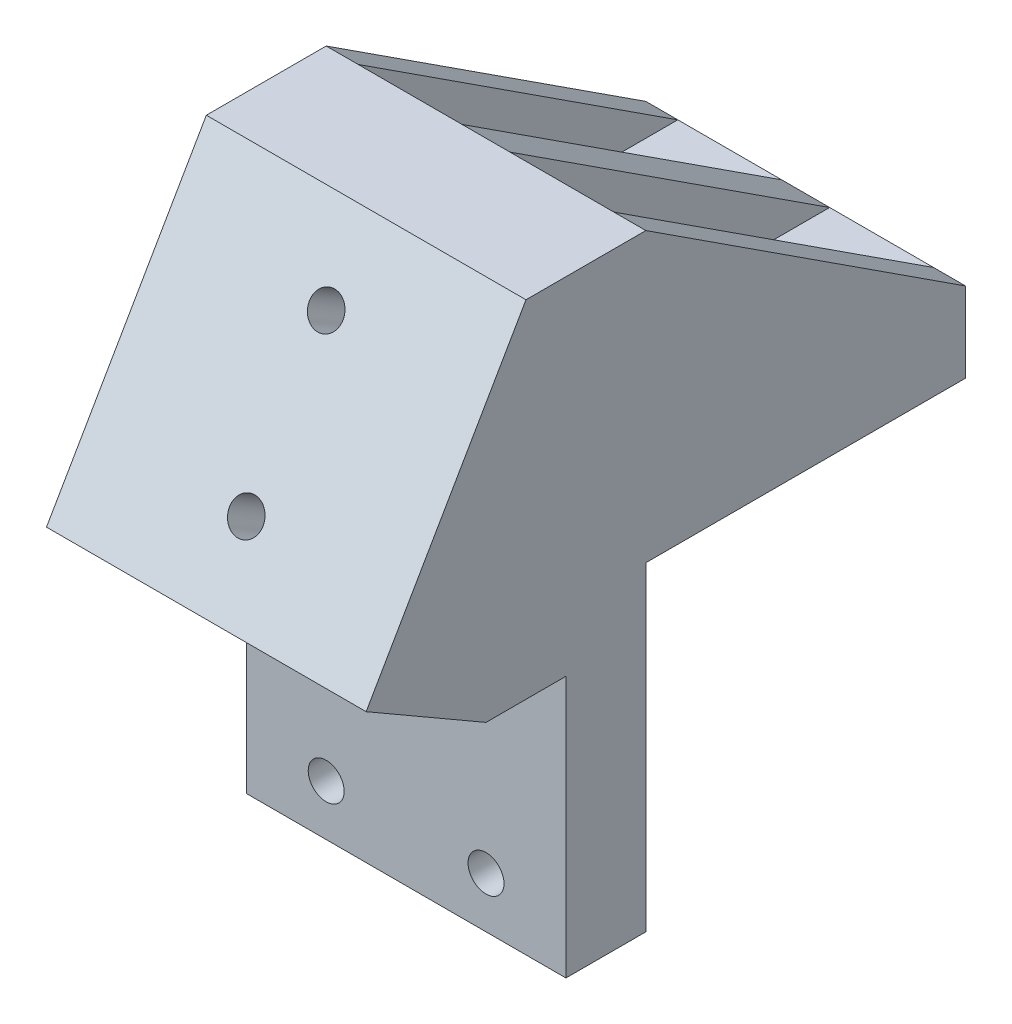
ISO-10303-21;
HEADER;
FILE_DESCRIPTION(('STEP AP214'),'2;1');
FILE_NAME('part.step','',(''),(''),'','','');
FILE_SCHEMA(('AUTOMOTIVE_DESIGN { 1 0 10303 214 1 1 1 1 }'));
ENDSEC;
DATA;
#1=APPLICATION_CONTEXT('core data for automotive mechanical design processes');
#2=APPLICATION_PROTOCOL_DEFINITION('international standard','automotive_design',2000,#1);
#3=PRODUCT_CONTEXT('',#1,'mechanical');
#4=PRODUCT('Part','Part','',(#3));
#5=PRODUCT_RELATED_PRODUCT_CATEGORY('part','',(#4));
#6=PRODUCT_DEFINITION_FORMATION('','',#4);
#7=PRODUCT_DEFINITION_CONTEXT('part definition',#1,'design');
#8=PRODUCT_DEFINITION('design','',#6,#7);
#9=PRODUCT_DEFINITION_SHAPE('','',#8);
#10=(LENGTH_UNIT() NAMED_UNIT(*) SI_UNIT(.MILLI.,.METRE.));
#11=(NAMED_UNIT(*) PLANE_ANGLE_UNIT() SI_UNIT($,.RADIAN.));
#12=(NAMED_UNIT(*) SI_UNIT($,.STERADIAN.) SOLID_ANGLE_UNIT());
#13=UNCERTAINTY_MEASURE_WITH_UNIT(LENGTH_MEASURE(1.E-05),#10,'distance_accuracy_value','');
#14=(GEOMETRIC_REPRESENTATION_CONTEXT(3) GLOBAL_UNCERTAINTY_ASSIGNED_CONTEXT((#13)) GLOBAL_UNIT_ASSIGNED_CONTEXT((#10,
#11,#12)) REPRESENTATION_CONTEXT('',''));
#15=CARTESIAN_POINT('',(0.,0.,0.));
#16=DIRECTION('',(0.,0.,1.));
#17=DIRECTION('',(1.,0.,0.));
#18=AXIS2_PLACEMENT_3D('',#15,#16,#17);
#19=CARTESIAN_POINT('',(40.,10.,-40.));
#20=DIRECTION('',(0.,-1.,0.));
#21=DIRECTION('',(0.,0.,-1.));
#22=AXIS2_PLACEMENT_3D('',#19,#20,#21);
#23=PLANE('',#22);
#24=CARTESIAN_POINT('',(30.,10.,-30.));
#25=DIRECTION('',(0.,-1.,0.));
#26=DIRECTION('',(0.,0.,-1.));
#27=AXIS2_PLACEMENT_3D('',#24,#25,#26);
#28=CIRCLE('',#27,2.25);
#29=CARTESIAN_POINT('',(30.,10.,-32.25));
#30=VERTEX_POINT('',#29);
#31=EDGE_CURVE('E190',#30,#30,#28,.T.);
#32=ORIENTED_EDGE('',*,*,#31,.T.);
#33=EDGE_LOOP('',(#32));
#34=FACE_BOUND('',#33,.T.);
#35=CARTESIAN_POINT('',(30.,10.,-10.));
#36=DIRECTION('',(0.,-1.,0.));
#37=DIRECTION('',(0.,0.,-1.));
#38=AXIS2_PLACEMENT_3D('',#35,#36,#37);
#39=CIRCLE('',#38,2.25);
#40=CARTESIAN_POINT('',(30.,10.,-12.25));
#41=VERTEX_POINT('',#40);
#42=EDGE_CURVE('E194',#41,#41,#39,.T.);
#43=ORIENTED_EDGE('',*,*,#42,.T.);
#44=EDGE_LOOP('',(#43));
#45=FACE_BOUND('',#44,.T.);
#46=DIRECTION('',(0.,0.,-1.));
#47=VECTOR('',#46,1.);
#48=CARTESIAN_POINT('',(23.,10.,0.));
#49=LINE('',#48,#47);
#50=CARTESIAN_POINT('',(23.,10.,0.));
#51=VERTEX_POINT('',#50);
#52=CARTESIAN_POINT('',(23.,10.,-40.));
#53=VERTEX_POINT('',#52);
#54=EDGE_CURVE('E160',#51,#53,#49,.T.);
#55=ORIENTED_EDGE('',*,*,#54,.F.);
#56=DIRECTION('',(-1.,0.,0.));
#57=VECTOR('',#56,1.);
#58=CARTESIAN_POINT('',(40.,10.,0.));
#59=LINE('',#58,#57);
#60=CARTESIAN_POINT('',(36.,10.,0.));
#61=VERTEX_POINT('',#60);
#62=EDGE_CURVE('E179',#61,#51,#59,.T.);
#63=ORIENTED_EDGE('',*,*,#62,.F.);
#64=DIRECTION('',(0.,0.,-1.));
#65=VECTOR('',#64,1.);
#66=CARTESIAN_POINT('',(36.,10.,0.));
#67=LINE('',#66,#65);
#68=CARTESIAN_POINT('',(36.,10.,-40.));
#69=VERTEX_POINT('',#68);
#70=EDGE_CURVE('E176',#61,#69,#67,.T.);
#71=ORIENTED_EDGE('',*,*,#70,.T.);
#72=DIRECTION('',(-1.,0.,0.));
#73=VECTOR('',#72,1.);
#74=CARTESIAN_POINT('',(40.,10.,-40.));
#75=LINE('',#74,#73);
#76=EDGE_CURVE('E173',#69,#53,#75,.T.);
#77=ORIENTED_EDGE('',*,*,#76,.T.);
#78=EDGE_LOOP('',(#55,#63,#71,#77));
#79=FACE_BOUND('',#78,.T.);
#80=ADVANCED_FACE('F33',(#34,#45,#79),#23,.F.);
#81=CARTESIAN_POINT('',(40.,10.,0.));
#82=DIRECTION('',(0.,0.,1.));
#83=DIRECTION('',(1.,0.,0.));
#84=AXIS2_PLACEMENT_3D('',#81,#82,#83);
#85=PLANE('',#84);
#86=DIRECTION('',(0.,-1.,0.));
#87=VECTOR('',#86,1.);
#88=CARTESIAN_POINT('',(23.,36.,0.));
#89=LINE('',#88,#87);
#90=CARTESIAN_POINT('',(23.,36.,0.));
#91=VERTEX_POINT('',#90);
#92=EDGE_CURVE('E159',#91,#51,#89,.T.);
#93=ORIENTED_EDGE('',*,*,#92,.F.);
#94=DIRECTION('',(-1.,0.,0.));
#95=VECTOR('',#94,1.);
#96=CARTESIAN_POINT('',(40.,36.,0.));
#97=LINE('',#96,#95);
#98=CARTESIAN_POINT('',(36.,36.,0.));
#99=VERTEX_POINT('',#98);
#100=EDGE_CURVE('E308',#99,#91,#97,.T.);
#101=ORIENTED_EDGE('',*,*,#100,.F.);
#102=DIRECTION('',(0.,-1.,0.));
#103=VECTOR('',#102,1.);
#104=CARTESIAN_POINT('',(36.,36.,0.));
#105=LINE('',#104,#103);
#106=EDGE_CURVE('E228',#99,#61,#105,.T.);
#107=ORIENTED_EDGE('',*,*,#106,.T.);
#108=ORIENTED_EDGE('',*,*,#62,.T.);
#109=EDGE_LOOP('',(#93,#101,#107,#108));
#110=FACE_BOUND('',#109,.T.);
#111=ADVANCED_FACE('F396',(#110),#85,.F.);
#112=CARTESIAN_POINT('',(40.,-40.,0.));
#113=DIRECTION('',(0.,0.,1.));
#114=DIRECTION('',(1.,0.,0.));
#115=AXIS2_PLACEMENT_3D('',#112,#113,#114);
#116=PLANE('',#115);
#117=CARTESIAN_POINT('',(10.,-13.6506350946109,0.));
#118=DIRECTION('',(0.,0.,1.));
#119=DIRECTION('',(1.,0.,0.));
#120=AXIS2_PLACEMENT_3D('',#117,#118,#119);
#121=CIRCLE('',#120,2.25);
#122=CARTESIAN_POINT('',(12.25,-13.6506350946109,0.));
#123=VERTEX_POINT('',#122);
#124=EDGE_CURVE('E189',#123,#123,#121,.T.);
#125=ORIENTED_EDGE('',*,*,#124,.T.);
#126=EDGE_LOOP('',(#125));
#127=FACE_BOUND('',#126,.T.);
#128=CARTESIAN_POINT('',(30.,-13.6506350946109,0.));
#129=DIRECTION('',(0.,0.,1.));
#130=DIRECTION('',(1.,0.,0.));
#131=AXIS2_PLACEMENT_3D('',#128,#129,#130);
#132=CIRCLE('',#131,2.25);
#133=CARTESIAN_POINT('',(32.25,-13.6506350946109,0.));
#134=VERTEX_POINT('',#133);
#135=EDGE_CURVE('E213',#134,#134,#132,.T.);
#136=ORIENTED_EDGE('',*,*,#135,.T.);
#137=EDGE_LOOP('',(#136));
#138=FACE_BOUND('',#137,.T.);
#139=CARTESIAN_POINT('',(30.,-33.6506350946109,0.));
#140=DIRECTION('',(0.,0.,1.));
#141=DIRECTION('',(1.,0.,0.));
#142=AXIS2_PLACEMENT_3D('',#139,#140,#141);
#143=CIRCLE('',#142,2.25);
#144=CARTESIAN_POINT('',(32.25,-33.6506350946109,0.));
#145=VERTEX_POINT('',#144);
#146=EDGE_CURVE('E209',#145,#145,#143,.T.);
#147=ORIENTED_EDGE('',*,*,#146,.T.);
#148=EDGE_LOOP('',(#147));
#149=FACE_BOUND('',#148,.T.);
#150=CARTESIAN_POINT('',(10.,-33.6506350946109,0.));
#151=DIRECTION('',(0.,0.,1.));
#152=DIRECTION('',(1.,0.,0.));
#153=AXIS2_PLACEMENT_3D('',#150,#151,#152);
#154=CIRCLE('',#153,2.25);
#155=CARTESIAN_POINT('',(12.25,-33.6506350946109,0.));
#156=VERTEX_POINT('',#155);
#157=EDGE_CURVE('E205',#156,#156,#154,.T.);
#158=ORIENTED_EDGE('',*,*,#157,.T.);
#159=EDGE_LOOP('',(#158));
#160=FACE_BOUND('',#159,.T.);
#161=DIRECTION('',(0.,1.,0.));
#162=VECTOR('',#161,1.);
#163=CARTESIAN_POINT('',(0.,-40.,0.));
#164=LINE('',#163,#162);
#165=CARTESIAN_POINT('',(0.,-40.,0.));
#166=VERTEX_POINT('',#165);
#167=CARTESIAN_POINT('',(0.,0.,0.));
#168=VERTEX_POINT('',#167);
#169=EDGE_CURVE('E248',#166,#168,#164,.T.);
#170=ORIENTED_EDGE('',*,*,#169,.T.);
#171=DIRECTION('',(-1.,0.,0.));
#172=VECTOR('',#171,1.);
#173=CARTESIAN_POINT('',(40.,0.,0.));
#174=LINE('',#173,#172);
#175=CARTESIAN_POINT('',(40.,0.,0.));
#176=VERTEX_POINT('',#175);
#177=EDGE_CURVE('E11',#176,#168,#174,.T.);
#178=ORIENTED_EDGE('',*,*,#177,.F.);
#179=DIRECTION('',(0.,1.,0.));
#180=VECTOR('',#179,1.);
#181=CARTESIAN_POINT('',(40.,-40.,0.));
#182=LINE('',#181,#180);
#183=CARTESIAN_POINT('',(40.,-40.,0.));
#184=VERTEX_POINT('',#183);
#185=EDGE_CURVE('E249',#184,#176,#182,.T.);
#186=ORIENTED_EDGE('',*,*,#185,.F.);
#187=DIRECTION('',(-1.,0.,0.));
#188=VECTOR('',#187,1.);
#189=CARTESIAN_POINT('',(40.,-40.,0.));
#190=LINE('',#189,#188);
#191=EDGE_CURVE('E270',#184,#166,#190,.T.);
#192=ORIENTED_EDGE('',*,*,#191,.T.);
#193=EDGE_LOOP('',(#170,#178,#186,#192));
#194=FACE_BOUND('',#193,.T.);
#195=ADVANCED_FACE('F35',(#127,#138,#149,#160,#194),#116,.F.);
#196=CARTESIAN_POINT('',(40.,0.,0.));
#197=DIRECTION('',(0.,1.,0.));
#198=DIRECTION('',(0.,0.,1.));
#199=AXIS2_PLACEMENT_3D('',#196,#197,#198);
#200=PLANE('',#199);
#201=CARTESIAN_POINT('',(10.,0.,-10.));
#202=DIRECTION('',(0.,1.,0.));
#203=DIRECTION('',(0.,0.,1.));
#204=AXIS2_PLACEMENT_3D('',#201,#202,#203);
#205=CIRCLE('',#204,2.25);
#206=CARTESIAN_POINT('',(10.,0.,-7.75));
#207=VERTEX_POINT('',#206);
#208=EDGE_CURVE('E201',#207,#207,#205,.T.);
#209=ORIENTED_EDGE('',*,*,#208,.T.);
#210=EDGE_LOOP('',(#209));
#211=FACE_BOUND('',#210,.T.);
#212=CARTESIAN_POINT('',(30.,0.,-10.));
#213=DIRECTION('',(0.,1.,0.));
#214=DIRECTION('',(0.,0.,1.));
#215=AXIS2_PLACEMENT_3D('',#212,#213,#214);
#216=CIRCLE('',#215,2.25);
#217=CARTESIAN_POINT('',(30.,0.,-7.75));
#218=VERTEX_POINT('',#217);
#219=EDGE_CURVE('E197',#218,#218,#216,.T.);
#220=ORIENTED_EDGE('',*,*,#219,.T.);
#221=EDGE_LOOP('',(#220));
#222=FACE_BOUND('',#221,.T.);
#223=CARTESIAN_POINT('',(30.,0.,-30.));
#224=DIRECTION('',(0.,1.,0.));
#225=DIRECTION('',(0.,0.,1.));
#226=AXIS2_PLACEMENT_3D('',#223,#224,#225);
#227=CIRCLE('',#226,2.25);
#228=CARTESIAN_POINT('',(30.,0.,-27.75));
#229=VERTEX_POINT('',#228);
#230=EDGE_CURVE('E193',#229,#229,#227,.T.);
#231=ORIENTED_EDGE('',*,*,#230,.T.);
#232=EDGE_LOOP('',(#231));
#233=FACE_BOUND('',#232,.T.);
#234=CARTESIAN_POINT('',(10.,0.,-30.));
#235=DIRECTION('',(0.,1.,0.));
#236=DIRECTION('',(0.,0.,1.));
#237=AXIS2_PLACEMENT_3D('',#234,#235,#236);
#238=CIRCLE('',#237,2.25);
#239=CARTESIAN_POINT('',(10.,0.,-27.75));
#240=VERTEX_POINT('',#239);
#241=EDGE_CURVE('E188',#240,#240,#238,.T.);
#242=ORIENTED_EDGE('',*,*,#241,.T.);
#243=EDGE_LOOP('',(#242));
#244=FACE_BOUND('',#243,.T.);
#245=DIRECTION('',(0.,0.,-1.));
#246=VECTOR('',#245,1.);
#247=CARTESIAN_POINT('',(0.,0.,0.));
#248=LINE('',#247,#246);
#249=CARTESIAN_POINT('',(0.,0.,-40.));
#250=VERTEX_POINT('',#249);
#251=EDGE_CURVE('E273',#168,#250,#248,.T.);
#252=ORIENTED_EDGE('',*,*,#251,.T.);
#253=DIRECTION('',(-1.,0.,0.));
#254=VECTOR('',#253,1.);
#255=CARTESIAN_POINT('',(40.,0.,-40.));
#256=LINE('',#255,#254);
#257=CARTESIAN_POINT('',(40.,0.,-40.));
#258=VERTEX_POINT('',#257);
#259=EDGE_CURVE('E42',#258,#250,#256,.T.);
#260=ORIENTED_EDGE('',*,*,#259,.F.);
#261=DIRECTION('',(0.,0.,-1.));
#262=VECTOR('',#261,1.);
#263=CARTESIAN_POINT('',(40.,0.,0.));
#264=LINE('',#263,#262);
#265=EDGE_CURVE('E252',#176,#258,#264,.T.);
#266=ORIENTED_EDGE('',*,*,#265,.F.);
#267=ORIENTED_EDGE('',*,*,#177,.T.);
#268=EDGE_LOOP('',(#252,#260,#266,#267));
#269=FACE_BOUND('',#268,.T.);
#270=ADVANCED_FACE('F389',(#211,#222,#233,#244,#269),#200,.F.);
#271=CARTESIAN_POINT('',(40.,0.,-40.));
#272=DIRECTION('',(0.,0.,1.));
#273=DIRECTION('',(1.,0.,0.));
#274=AXIS2_PLACEMENT_3D('',#271,#272,#273);
#275=PLANE('',#274);
#276=DIRECTION('',(0.,1.,0.));
#277=VECTOR('',#276,1.);
#278=CARTESIAN_POINT('',(0.,0.,-40.));
#279=LINE('',#278,#277);
#280=CARTESIAN_POINT('',(0.,10.,-40.));
#281=VERTEX_POINT('',#280);
#282=EDGE_CURVE('E275',#250,#281,#279,.T.);
#283=ORIENTED_EDGE('',*,*,#282,.T.);
#284=DIRECTION('',(-1.,0.,0.));
#285=VECTOR('',#284,1.);
#286=CARTESIAN_POINT('',(4.,10.,-40.));
#287=LINE('',#286,#285);
#288=CARTESIAN_POINT('',(4.,10.,-40.));
#289=VERTEX_POINT('',#288);
#290=EDGE_CURVE('E327',#289,#281,#287,.T.);
#291=ORIENTED_EDGE('',*,*,#290,.F.);
#292=CARTESIAN_POINT('',(17.,10.,-40.));
#293=VERTEX_POINT('',#292);
#294=EDGE_CURVE('E58',#293,#289,#75,.T.);
#295=ORIENTED_EDGE('',*,*,#294,.F.);
#296=DIRECTION('',(1.,0.,0.));
#297=VECTOR('',#296,1.);
#298=CARTESIAN_POINT('',(17.,10.,-40.));
#299=LINE('',#298,#297);
#300=EDGE_CURVE('E154',#293,#53,#299,.T.);
#301=ORIENTED_EDGE('',*,*,#300,.T.);
#302=ORIENTED_EDGE('',*,*,#76,.F.);
#303=CARTESIAN_POINT('',(40.,10.,-40.));
#304=VERTEX_POINT('',#303);
#305=EDGE_CURVE('E177',#304,#69,#75,.T.);
#306=ORIENTED_EDGE('',*,*,#305,.F.);
#307=DIRECTION('',(0.,1.,0.));
#308=VECTOR('',#307,1.);
#309=CARTESIAN_POINT('',(40.,0.,-40.));
#310=LINE('',#309,#308);
#311=EDGE_CURVE('E255',#258,#304,#310,.T.);
#312=ORIENTED_EDGE('',*,*,#311,.F.);
#313=ORIENTED_EDGE('',*,*,#259,.T.);
#314=EDGE_LOOP('',(#283,#291,#295,#301,#302,#306,#312,#313));
#315=FACE_BOUND('',#314,.T.);
#316=ADVANCED_FACE('F171',(#315),#275,.F.);
#317=CARTESIAN_POINT('',(10.,10.,-10.));
#318=DIRECTION('',(0.,-1.,0.));
#319=DIRECTION('',(0.,0.,-1.));
#320=AXIS2_PLACEMENT_3D('',#317,#318,#319);
#321=CIRCLE('',#320,2.25);
#322=CARTESIAN_POINT('',(10.,10.,-12.25));
#323=VERTEX_POINT('',#322);
#324=EDGE_CURVE('E198',#323,#323,#321,.T.);
#325=ORIENTED_EDGE('',*,*,#324,.T.);
#326=EDGE_LOOP('',(#325));
#327=FACE_BOUND('',#326,.T.);
#328=CARTESIAN_POINT('',(10.,10.,-30.));
#329=DIRECTION('',(0.,-1.,0.));
#330=DIRECTION('',(0.,0.,-1.));
#331=AXIS2_PLACEMENT_3D('',#328,#329,#330);
#332=CIRCLE('',#331,2.25);
#333=CARTESIAN_POINT('',(10.,10.,-32.25));
#334=VERTEX_POINT('',#333);
#335=EDGE_CURVE('E185',#334,#334,#332,.T.);
#336=ORIENTED_EDGE('',*,*,#335,.T.);
#337=EDGE_LOOP('',(#336));
#338=FACE_BOUND('',#337,.T.);
#339=CARTESIAN_POINT('',(17.,10.,0.));
#340=VERTEX_POINT('',#339);
#341=CARTESIAN_POINT('',(4.,10.,0.));
#342=VERTEX_POINT('',#341);
#343=EDGE_CURVE('E307',#340,#342,#59,.T.);
#344=ORIENTED_EDGE('',*,*,#343,.F.);
#345=DIRECTION('',(0.,0.,-1.));
#346=VECTOR('',#345,1.);
#347=CARTESIAN_POINT('',(17.,10.,0.));
#348=LINE('',#347,#346);
#349=EDGE_CURVE('E397',#340,#293,#348,.T.);
#350=ORIENTED_EDGE('',*,*,#349,.T.);
#351=ORIENTED_EDGE('',*,*,#294,.T.);
#352=DIRECTION('',(0.,0.,1.));
#353=VECTOR('',#352,1.);
#354=CARTESIAN_POINT('',(4.,10.,0.));
#355=LINE('',#354,#353);
#356=EDGE_CURVE('E328',#289,#342,#355,.T.);
#357=ORIENTED_EDGE('',*,*,#356,.T.);
#358=EDGE_LOOP('',(#344,#350,#351,#357));
#359=FACE_BOUND('',#358,.T.);
#360=ADVANCED_FACE('F403',(#327,#338,#359),#23,.F.);
#361=CARTESIAN_POINT('',(17.,36.,0.));
#362=VERTEX_POINT('',#361);
#363=CARTESIAN_POINT('',(4.,36.,0.));
#364=VERTEX_POINT('',#363);
#365=EDGE_CURVE('E304',#362,#364,#97,.T.);
#366=ORIENTED_EDGE('',*,*,#365,.F.);
#367=DIRECTION('',(0.,-1.,0.));
#368=VECTOR('',#367,1.);
#369=CARTESIAN_POINT('',(17.,36.,0.));
#370=LINE('',#369,#368);
#371=EDGE_CURVE('E50',#362,#340,#370,.T.);
#372=ORIENTED_EDGE('',*,*,#371,.T.);
#373=ORIENTED_EDGE('',*,*,#343,.T.);
#374=DIRECTION('',(0.,1.,0.));
#375=VECTOR('',#374,1.);
#376=CARTESIAN_POINT('',(4.,0.,0.));
#377=LINE('',#376,#375);
#378=EDGE_CURVE('E321',#342,#364,#377,.T.);
#379=ORIENTED_EDGE('',*,*,#378,.T.);
#380=EDGE_LOOP('',(#366,#372,#373,#379));
#381=FACE_BOUND('',#380,.T.);
#382=ADVANCED_FACE('F322',(#381),#85,.F.);
#383=CARTESIAN_POINT('',(40.,36.,0.));
#384=DIRECTION('',(0.,-1.,0.));
#385=DIRECTION('',(0.,0.,-1.));
#386=AXIS2_PLACEMENT_3D('',#383,#384,#385);
#387=PLANE('',#386);
#388=DIRECTION('',(0.,0.,1.));
#389=VECTOR('',#388,1.);
#390=CARTESIAN_POINT('',(0.,36.,0.));
#391=LINE('',#390,#389);
#392=CARTESIAN_POINT('',(0.,36.,0.));
#393=VERTEX_POINT('',#392);
#394=CARTESIAN_POINT('',(0.,36.,15.));
#395=VERTEX_POINT('',#394);
#396=EDGE_CURVE('E277',#393,#395,#391,.T.);
#397=ORIENTED_EDGE('',*,*,#396,.T.);
#398=DIRECTION('',(-1.,0.,0.));
#399=VECTOR('',#398,1.);
#400=CARTESIAN_POINT('',(40.,36.,15.));
#401=LINE('',#400,#399);
#402=CARTESIAN_POINT('',(40.,36.,15.));
#403=VERTEX_POINT('',#402);
#404=EDGE_CURVE('E302',#403,#395,#401,.T.);
#405=ORIENTED_EDGE('',*,*,#404,.F.);
#406=DIRECTION('',(0.,0.,1.));
#407=VECTOR('',#406,1.);
#408=CARTESIAN_POINT('',(40.,36.,0.));
#409=LINE('',#408,#407);
#410=CARTESIAN_POINT('',(40.,36.,0.));
#411=VERTEX_POINT('',#410);
#412=EDGE_CURVE('E258',#411,#403,#409,.T.);
#413=ORIENTED_EDGE('',*,*,#412,.F.);
#414=EDGE_CURVE('E305',#411,#99,#97,.T.);
#415=ORIENTED_EDGE('',*,*,#414,.T.);
#416=ORIENTED_EDGE('',*,*,#100,.T.);
#417=DIRECTION('',(1.,0.,0.));
#418=VECTOR('',#417,1.);
#419=CARTESIAN_POINT('',(17.,36.,0.));
#420=LINE('',#419,#418);
#421=EDGE_CURVE('E156',#362,#91,#420,.T.);
#422=ORIENTED_EDGE('',*,*,#421,.F.);
#423=ORIENTED_EDGE('',*,*,#365,.T.);
#424=DIRECTION('',(-1.,0.,0.));
#425=VECTOR('',#424,1.);
#426=CARTESIAN_POINT('',(4.,36.,0.));
#427=LINE('',#426,#425);
#428=EDGE_CURVE('E317',#364,#393,#427,.T.);
#429=ORIENTED_EDGE('',*,*,#428,.T.);
#430=EDGE_LOOP('',(#397,#405,#413,#415,#416,#422,#423,#429));
#431=FACE_BOUND('',#430,.T.);
#432=ADVANCED_FACE('F315',(#431),#387,.F.);
#433=CARTESIAN_POINT('',(40.,36.,15.));
#434=DIRECTION('',(0.,-0.499999999999995,-0.866025403784442));
#435=DIRECTION('',(0.,0.866025403784442,-0.499999999999995));
#436=AXIS2_PLACEMENT_3D('',#433,#434,#435);
#437=PLANE('',#436);
#438=CARTESIAN_POINT('',(20.,10.0192378864667,29.9999999999998));
#439=DIRECTION('',(0.,-0.499999999999995,-0.866025403784442));
#440=DIRECTION('',(0.,0.866025403784442,-0.499999999999995));
#441=AXIS2_PLACEMENT_3D('',#438,#439,#440);
#442=CIRCLE('',#441,2.1);
#443=CARTESIAN_POINT('',(20.,11.8378912344141,28.9499999999999));
#444=VERTEX_POINT('',#443);
#445=EDGE_CURVE('E37',#444,#444,#442,.F.);
#446=ORIENTED_EDGE('',*,*,#445,.F.);
#447=EDGE_LOOP('',(#446));
#448=FACE_BOUND('',#447,.T.);
#449=CARTESIAN_POINT('',(20.,27.3397459621556,19.9999999999999));
#450=DIRECTION('',(0.,-0.499999999999995,-0.866025403784442));
#451=DIRECTION('',(0.,0.866025403784442,-0.499999999999995));
#452=AXIS2_PLACEMENT_3D('',#449,#450,#451);
#453=CIRCLE('',#452,2.1);
#454=CARTESIAN_POINT('',(20.,29.1583993101029,18.95));
#455=VERTEX_POINT('',#454);
#456=EDGE_CURVE('E216',#455,#455,#453,.F.);
#457=ORIENTED_EDGE('',*,*,#456,.F.);
#458=EDGE_LOOP('',(#457));
#459=FACE_BOUND('',#458,.T.);
#460=DIRECTION('',(0.,-0.866025403784442,0.499999999999995));
#461=VECTOR('',#460,1.);
#462=CARTESIAN_POINT('',(0.,36.,15.));
#463=LINE('',#462,#461);
#464=CARTESIAN_POINT('',(0.,1.35898384862231,34.9999999999998));
#465=VERTEX_POINT('',#464);
#466=EDGE_CURVE('E279',#395,#465,#463,.T.);
#467=ORIENTED_EDGE('',*,*,#466,.T.);
#468=DIRECTION('',(-1.,0.,0.));
#469=VECTOR('',#468,1.);
#470=CARTESIAN_POINT('',(40.,1.35898384862231,34.9999999999998));
#471=LINE('',#470,#469);
#472=CARTESIAN_POINT('',(40.,1.35898384862231,34.9999999999998));
#473=VERTEX_POINT('',#472);
#474=EDGE_CURVE('E299',#473,#465,#471,.T.);
#475=ORIENTED_EDGE('',*,*,#474,.F.);
#476=DIRECTION('',(0.,-0.866025403784442,0.499999999999995));
#477=VECTOR('',#476,1.);
#478=CARTESIAN_POINT('',(40.,36.,15.));
#479=LINE('',#478,#477);
#480=EDGE_CURVE('E260',#403,#473,#479,.T.);
#481=ORIENTED_EDGE('',*,*,#480,.F.);
#482=ORIENTED_EDGE('',*,*,#404,.T.);
#483=EDGE_LOOP('',(#467,#475,#481,#482));
#484=FACE_BOUND('',#483,.T.);
#485=ADVANCED_FACE('F363',(#448,#459,#484),#437,.F.);
#486=CARTESIAN_POINT('',(40.,1.35898384862231,34.9999999999998));
#487=DIRECTION('',(0.,0.866025403784444,-0.499999999999992));
#488=DIRECTION('',(0.,0.499999999999992,0.866025403784444));
#489=AXIS2_PLACEMENT_3D('',#486,#487,#488);
#490=PLANE('',#489);
#491=DIRECTION('',(0.,-0.499999999999992,-0.866025403784444));
#492=VECTOR('',#491,1.);
#493=CARTESIAN_POINT('',(0.,1.35898384862231,34.9999999999998));
#494=LINE('',#493,#492);
#495=CARTESIAN_POINT('',(0.,-7.30127018922176,20.));
#496=VERTEX_POINT('',#495);
#497=EDGE_CURVE('E281',#465,#496,#494,.T.);
#498=ORIENTED_EDGE('',*,*,#497,.T.);
#499=DIRECTION('',(-1.,0.,0.));
#500=VECTOR('',#499,1.);
#501=CARTESIAN_POINT('',(40.,-7.30127018922176,20.));
#502=LINE('',#501,#500);
#503=CARTESIAN_POINT('',(40.,-7.30127018922176,20.));
#504=VERTEX_POINT('',#503);
#505=EDGE_CURVE('E296',#504,#496,#502,.T.);
#506=ORIENTED_EDGE('',*,*,#505,.F.);
#507=DIRECTION('',(0.,-0.499999999999992,-0.866025403784444));
#508=VECTOR('',#507,1.);
#509=CARTESIAN_POINT('',(40.,1.35898384862231,34.9999999999998));
#510=LINE('',#509,#508);
#511=EDGE_CURVE('E262',#473,#504,#510,.T.);
#512=ORIENTED_EDGE('',*,*,#511,.F.);
#513=ORIENTED_EDGE('',*,*,#474,.T.);
#514=EDGE_LOOP('',(#498,#506,#512,#513));
#515=FACE_BOUND('',#514,.T.);
#516=ADVANCED_FACE('F369',(#515),#490,.F.);
#517=CARTESIAN_POINT('',(40.,-7.30127018922176,20.));
#518=DIRECTION('',(0.,1.,0.));
#519=DIRECTION('',(0.,0.,1.));
#520=AXIS2_PLACEMENT_3D('',#517,#518,#519);
#521=PLANE('',#520);
#522=DIRECTION('',(0.,0.,-1.));
#523=VECTOR('',#522,1.);
#524=CARTESIAN_POINT('',(0.,-7.30127018922176,20.));
#525=LINE('',#524,#523);
#526=CARTESIAN_POINT('',(0.,-7.30127018922176,10.));
#527=VERTEX_POINT('',#526);
#528=EDGE_CURVE('E283',#496,#527,#525,.T.);
#529=ORIENTED_EDGE('',*,*,#528,.T.);
#530=DIRECTION('',(-1.,0.,0.));
#531=VECTOR('',#530,1.);
#532=CARTESIAN_POINT('',(40.,-7.30127018922176,10.));
#533=LINE('',#532,#531);
#534=CARTESIAN_POINT('',(40.,-7.30127018922176,10.));
#535=VERTEX_POINT('',#534);
#536=EDGE_CURVE('E293',#535,#527,#533,.T.);
#537=ORIENTED_EDGE('',*,*,#536,.F.);
#538=DIRECTION('',(0.,0.,-1.));
#539=VECTOR('',#538,1.);
#540=CARTESIAN_POINT('',(40.,-7.30127018922176,20.));
#541=LINE('',#540,#539);
#542=EDGE_CURVE('E264',#504,#535,#541,.T.);
#543=ORIENTED_EDGE('',*,*,#542,.F.);
#544=ORIENTED_EDGE('',*,*,#505,.T.);
#545=EDGE_LOOP('',(#529,#537,#543,#544));
#546=FACE_BOUND('',#545,.T.);
#547=ADVANCED_FACE('F373',(#546),#521,.F.);
#548=CARTESIAN_POINT('',(40.,-7.30127018922176,10.));
#549=DIRECTION('',(0.,0.,-1.));
#550=DIRECTION('',(0.,1.,0.));
#551=AXIS2_PLACEMENT_3D('',#548,#549,#550);
#552=PLANE('',#551);
#553=CARTESIAN_POINT('',(10.,-13.6506350946109,10.));
#554=DIRECTION('',(0.,0.,-1.));
#555=DIRECTION('',(0.,1.,0.));
#556=AXIS2_PLACEMENT_3D('',#553,#554,#555);
#557=CIRCLE('',#556,2.25);
#558=CARTESIAN_POINT('',(10.,-11.4006350946109,10.));
#559=VERTEX_POINT('',#558);
#560=EDGE_CURVE('E214',#559,#559,#557,.T.);
#561=ORIENTED_EDGE('',*,*,#560,.T.);
#562=EDGE_LOOP('',(#561));
#563=FACE_BOUND('',#562,.T.);
#564=CARTESIAN_POINT('',(30.,-13.6506350946109,10.));
#565=DIRECTION('',(0.,0.,-1.));
#566=DIRECTION('',(0.,1.,0.));
#567=AXIS2_PLACEMENT_3D('',#564,#565,#566);
#568=CIRCLE('',#567,2.25);
#569=CARTESIAN_POINT('',(30.,-11.4006350946109,10.));
#570=VERTEX_POINT('',#569);
#571=EDGE_CURVE('E210',#570,#570,#568,.T.);
#572=ORIENTED_EDGE('',*,*,#571,.T.);
#573=EDGE_LOOP('',(#572));
#574=FACE_BOUND('',#573,.T.);
#575=CARTESIAN_POINT('',(30.,-33.6506350946109,10.));
#576=DIRECTION('',(0.,0.,-1.));
#577=DIRECTION('',(0.,1.,0.));
#578=AXIS2_PLACEMENT_3D('',#575,#576,#577);
#579=CIRCLE('',#578,2.25);
#580=CARTESIAN_POINT('',(30.,-31.4006350946109,10.));
#581=VERTEX_POINT('',#580);
#582=EDGE_CURVE('E206',#581,#581,#579,.T.);
#583=ORIENTED_EDGE('',*,*,#582,.T.);
#584=EDGE_LOOP('',(#583));
#585=FACE_BOUND('',#584,.T.);
#586=CARTESIAN_POINT('',(10.,-33.6506350946109,10.));
#587=DIRECTION('',(0.,0.,-1.));
#588=DIRECTION('',(0.,1.,0.));
#589=AXIS2_PLACEMENT_3D('',#586,#587,#588);
#590=CIRCLE('',#589,2.25);
#591=CARTESIAN_POINT('',(10.,-31.4006350946109,10.));
#592=VERTEX_POINT('',#591);
#593=EDGE_CURVE('E202',#592,#592,#590,.T.);
#594=ORIENTED_EDGE('',*,*,#593,.T.);
#595=EDGE_LOOP('',(#594));
#596=FACE_BOUND('',#595,.T.);
#597=DIRECTION('',(0.,-1.,0.));
#598=VECTOR('',#597,1.);
#599=CARTESIAN_POINT('',(0.,-7.30127018922176,10.));
#600=LINE('',#599,#598);
#601=CARTESIAN_POINT('',(0.,-40.,10.));
#602=VERTEX_POINT('',#601);
#603=EDGE_CURVE('E285',#527,#602,#600,.T.);
#604=ORIENTED_EDGE('',*,*,#603,.T.);
#605=DIRECTION('',(-1.,0.,0.));
#606=VECTOR('',#605,1.);
#607=CARTESIAN_POINT('',(40.,-40.,10.));
#608=LINE('',#607,#606);
#609=CARTESIAN_POINT('',(40.,-40.,10.));
#610=VERTEX_POINT('',#609);
#611=EDGE_CURVE('E290',#610,#602,#608,.T.);
#612=ORIENTED_EDGE('',*,*,#611,.F.);
#613=DIRECTION('',(0.,-1.,0.));
#614=VECTOR('',#613,1.);
#615=CARTESIAN_POINT('',(40.,-7.30127018922176,10.));
#616=LINE('',#615,#614);
#617=EDGE_CURVE('E266',#535,#610,#616,.T.);
#618=ORIENTED_EDGE('',*,*,#617,.F.);
#619=ORIENTED_EDGE('',*,*,#536,.T.);
#620=EDGE_LOOP('',(#604,#612,#618,#619));
#621=FACE_BOUND('',#620,.T.);
#622=ADVANCED_FACE('F378',(#563,#574,#585,#596,#621),#552,.F.);
#623=CARTESIAN_POINT('',(40.,-40.,10.));
#624=DIRECTION('',(0.,1.,0.));
#625=DIRECTION('',(0.,0.,1.));
#626=AXIS2_PLACEMENT_3D('',#623,#624,#625);
#627=PLANE('',#626);
#628=DIRECTION('',(0.,0.,-1.));
#629=VECTOR('',#628,1.);
#630=CARTESIAN_POINT('',(0.,-40.,10.));
#631=LINE('',#630,#629);
#632=EDGE_CURVE('E253',#602,#166,#631,.T.);
#633=ORIENTED_EDGE('',*,*,#632,.T.);
#634=ORIENTED_EDGE('',*,*,#191,.F.);
#635=DIRECTION('',(0.,0.,-1.));
#636=VECTOR('',#635,1.);
#637=CARTESIAN_POINT('',(40.,-40.,10.));
#638=LINE('',#637,#636);
#639=EDGE_CURVE('E268',#610,#184,#638,.T.);
#640=ORIENTED_EDGE('',*,*,#639,.F.);
#641=ORIENTED_EDGE('',*,*,#611,.T.);
#642=EDGE_LOOP('',(#633,#634,#640,#641));
#643=FACE_BOUND('',#642,.T.);
#644=ADVANCED_FACE('F384',(#643),#627,.F.);
#645=CARTESIAN_POINT('',(40.,0.,0.));
#646=DIRECTION('',(-1.,0.,0.));
#647=DIRECTION('',(0.,0.,1.));
#648=AXIS2_PLACEMENT_3D('',#645,#646,#647);
#649=PLANE('',#648);
#650=ORIENTED_EDGE('',*,*,#185,.T.);
#651=ORIENTED_EDGE('',*,*,#265,.T.);
#652=ORIENTED_EDGE('',*,*,#311,.T.);
#653=DIRECTION('',(0.,0.544988350595414,0.838443616300637));
#654=VECTOR('',#653,1.);
#655=CARTESIAN_POINT('',(40.,10.,-40.));
#656=LINE('',#655,#654);
#657=EDGE_CURVE('E338',#304,#411,#656,.T.);
#658=ORIENTED_EDGE('',*,*,#657,.T.);
#659=ORIENTED_EDGE('',*,*,#412,.T.);
#660=ORIENTED_EDGE('',*,*,#480,.T.);
#661=ORIENTED_EDGE('',*,*,#511,.T.);
#662=ORIENTED_EDGE('',*,*,#542,.T.);
#663=ORIENTED_EDGE('',*,*,#617,.T.);
#664=ORIENTED_EDGE('',*,*,#639,.T.);
#665=EDGE_LOOP('',(#650,#651,#652,#658,#659,#660,#661,#662,#663,#664));
#666=FACE_BOUND('',#665,.T.);
#667=ADVANCED_FACE('F352',(#666),#649,.F.);
#668=CARTESIAN_POINT('',(0.,0.,0.));
#669=DIRECTION('',(-1.,0.,0.));
#670=DIRECTION('',(0.,0.,1.));
#671=AXIS2_PLACEMENT_3D('',#668,#669,#670);
#672=PLANE('',#671);
#673=ORIENTED_EDGE('',*,*,#396,.F.);
#674=DIRECTION('',(0.,-0.544988350595414,-0.838443616300637));
#675=VECTOR('',#674,1.);
#676=CARTESIAN_POINT('',(0.,25.3075571177504,-16.4499121265378));
#677=LINE('',#676,#675);
#678=EDGE_CURVE('E337',#393,#281,#677,.T.);
#679=ORIENTED_EDGE('',*,*,#678,.T.);
#680=ORIENTED_EDGE('',*,*,#282,.F.);
#681=ORIENTED_EDGE('',*,*,#251,.F.);
#682=ORIENTED_EDGE('',*,*,#169,.F.);
#683=ORIENTED_EDGE('',*,*,#632,.F.);
#684=ORIENTED_EDGE('',*,*,#603,.F.);
#685=ORIENTED_EDGE('',*,*,#528,.F.);
#686=ORIENTED_EDGE('',*,*,#497,.F.);
#687=ORIENTED_EDGE('',*,*,#466,.F.);
#688=EDGE_LOOP('',(#673,#679,#680,#681,#682,#683,#684,#685,#686,#687));
#689=FACE_BOUND('',#688,.T.);
#690=ADVANCED_FACE('F436',(#689),#672,.T.);
#691=CARTESIAN_POINT('',(10.,-40.,-30.));
#692=DIRECTION('',(0.,1.,0.));
#693=DIRECTION('',(0.,0.,1.));
#694=AXIS2_PLACEMENT_3D('',#691,#692,#693);
#695=CYLINDRICAL_SURFACE('',#694,2.25);
#696=ORIENTED_EDGE('',*,*,#335,.F.);
#697=EDGE_LOOP('',(#696));
#698=FACE_BOUND('',#697,.T.);
#699=ORIENTED_EDGE('',*,*,#241,.F.);
#700=EDGE_LOOP('',(#699));
#701=FACE_BOUND('',#700,.T.);
#702=ADVANCED_FACE('F432',(#698,#701),#695,.F.);
#703=CARTESIAN_POINT('',(30.,-40.,-30.));
#704=DIRECTION('',(0.,1.,0.));
#705=DIRECTION('',(0.,0.,1.));
#706=AXIS2_PLACEMENT_3D('',#703,#704,#705);
#707=CYLINDRICAL_SURFACE('',#706,2.25);
#708=ORIENTED_EDGE('',*,*,#31,.F.);
#709=EDGE_LOOP('',(#708));
#710=FACE_BOUND('',#709,.T.);
#711=ORIENTED_EDGE('',*,*,#230,.F.);
#712=EDGE_LOOP('',(#711));
#713=FACE_BOUND('',#712,.T.);
#714=ADVANCED_FACE('F435',(#710,#713),#707,.F.);
#715=CARTESIAN_POINT('',(30.,-40.,-10.));
#716=DIRECTION('',(0.,1.,0.));
#717=DIRECTION('',(0.,0.,1.));
#718=AXIS2_PLACEMENT_3D('',#715,#716,#717);
#719=CYLINDRICAL_SURFACE('',#718,2.25);
#720=ORIENTED_EDGE('',*,*,#42,.F.);
#721=EDGE_LOOP('',(#720));
#722=FACE_BOUND('',#721,.T.);
#723=ORIENTED_EDGE('',*,*,#219,.F.);
#724=EDGE_LOOP('',(#723));
#725=FACE_BOUND('',#724,.T.);
#726=ADVANCED_FACE('F453',(#722,#725),#719,.F.);
#727=CARTESIAN_POINT('',(10.,-40.,-10.));
#728=DIRECTION('',(0.,1.,0.));
#729=DIRECTION('',(0.,0.,1.));
#730=AXIS2_PLACEMENT_3D('',#727,#728,#729);
#731=CYLINDRICAL_SURFACE('',#730,2.25);
#732=ORIENTED_EDGE('',*,*,#324,.F.);
#733=EDGE_LOOP('',(#732));
#734=FACE_BOUND('',#733,.T.);
#735=ORIENTED_EDGE('',*,*,#208,.F.);
#736=EDGE_LOOP('',(#735));
#737=FACE_BOUND('',#736,.T.);
#738=ADVANCED_FACE('F459',(#734,#737),#731,.F.);
#739=CARTESIAN_POINT('',(10.,-33.6506350946109,-40.));
#740=DIRECTION('',(0.,0.,1.));
#741=DIRECTION('',(1.,0.,0.));
#742=AXIS2_PLACEMENT_3D('',#739,#740,#741);
#743=CYLINDRICAL_SURFACE('',#742,2.25);
#744=ORIENTED_EDGE('',*,*,#593,.F.);
#745=EDGE_LOOP('',(#744));
#746=FACE_BOUND('',#745,.T.);
#747=ORIENTED_EDGE('',*,*,#157,.F.);
#748=EDGE_LOOP('',(#747));
#749=FACE_BOUND('',#748,.T.);
#750=ADVANCED_FACE('F464',(#746,#749),#743,.F.);
#751=CARTESIAN_POINT('',(30.,-33.6506350946109,-40.));
#752=DIRECTION('',(0.,0.,1.));
#753=DIRECTION('',(1.,0.,0.));
#754=AXIS2_PLACEMENT_3D('',#751,#752,#753);
#755=CYLINDRICAL_SURFACE('',#754,2.25);
#756=ORIENTED_EDGE('',*,*,#582,.F.);
#757=EDGE_LOOP('',(#756));
#758=FACE_BOUND('',#757,.T.);
#759=ORIENTED_EDGE('',*,*,#146,.F.);
#760=EDGE_LOOP('',(#759));
#761=FACE_BOUND('',#760,.T.);
#762=ADVANCED_FACE('F690',(#758,#761),#755,.F.);
#763=CARTESIAN_POINT('',(30.,-13.6506350946109,-40.));
#764=DIRECTION('',(0.,0.,1.));
#765=DIRECTION('',(1.,0.,0.));
#766=AXIS2_PLACEMENT_3D('',#763,#764,#765);
#767=CYLINDRICAL_SURFACE('',#766,2.25);
#768=ORIENTED_EDGE('',*,*,#571,.F.);
#769=EDGE_LOOP('',(#768));
#770=FACE_BOUND('',#769,.T.);
#771=ORIENTED_EDGE('',*,*,#135,.F.);
#772=EDGE_LOOP('',(#771));
#773=FACE_BOUND('',#772,.T.);
#774=ADVANCED_FACE('F683',(#770,#773),#767,.F.);
#775=CARTESIAN_POINT('',(10.,-13.6506350946109,-40.));
#776=DIRECTION('',(0.,0.,1.));
#777=DIRECTION('',(1.,0.,0.));
#778=AXIS2_PLACEMENT_3D('',#775,#776,#777);
#779=CYLINDRICAL_SURFACE('',#778,2.25);
#780=ORIENTED_EDGE('',*,*,#560,.F.);
#781=EDGE_LOOP('',(#780));
#782=FACE_BOUND('',#781,.T.);
#783=ORIENTED_EDGE('',*,*,#124,.F.);
#784=EDGE_LOOP('',(#783));
#785=FACE_BOUND('',#784,.T.);
#786=ADVANCED_FACE('F676',(#782,#785),#779,.F.);
#787=CARTESIAN_POINT('',(20.,35.9999999999998,34.9999999999999));
#788=DIRECTION('',(0.,-0.499999999999995,-0.866025403784442));
#789=DIRECTION('',(0.,0.866025403784442,-0.499999999999995));
#790=AXIS2_PLACEMENT_3D('',#787,#788,#789);
#791=CYLINDRICAL_SURFACE('',#790,2.1);
#792=CARTESIAN_POINT('',(20.,17.3397459621557,2.67949192431113));
#793=DIRECTION('',(0.,0.499999999999995,0.866025403784442));
#794=DIRECTION('',(0.,-0.866025403784442,0.499999999999995));
#795=AXIS2_PLACEMENT_3D('',#792,#793,#794);
#796=CIRCLE('',#795,2.1);
#797=CARTESIAN_POINT('',(20.,15.5210926142084,3.72949192431112));
#798=VERTEX_POINT('',#797);
#799=EDGE_CURVE('E218',#798,#798,#796,.T.);
#800=ORIENTED_EDGE('',*,*,#799,.F.);
#801=EDGE_LOOP('',(#800));
#802=FACE_BOUND('',#801,.T.);
#803=ORIENTED_EDGE('',*,*,#456,.T.);
#804=EDGE_LOOP('',(#803));
#805=FACE_BOUND('',#804,.T.);
#806=ADVANCED_FACE('F670',(#802,#805),#791,.F.);
#807=CARTESIAN_POINT('',(20.,17.3397459621557,2.67949192431113));
#808=DIRECTION('',(0.,0.499999999999995,0.866025403784442));
#809=DIRECTION('',(0.,-0.866025403784442,0.499999999999995));
#810=AXIS2_PLACEMENT_3D('',#807,#808,#809);
#811=PLANE('',#810);
#812=ORIENTED_EDGE('',*,*,#799,.T.);
#813=EDGE_LOOP('',(#812));
#814=FACE_BOUND('',#813,.T.);
#815=ADVANCED_FACE('F662',(#814),#811,.T.);
#816=CARTESIAN_POINT('',(20.,18.679491924311,44.9999999999998));
#817=DIRECTION('',(0.,-0.499999999999995,-0.866025403784442));
#818=DIRECTION('',(0.,0.866025403784442,-0.499999999999995));
#819=AXIS2_PLACEMENT_3D('',#816,#817,#818);
#820=CYLINDRICAL_SURFACE('',#819,2.1);
#821=CARTESIAN_POINT('',(20.,0.0192378864668531,12.679491924311));
#822=DIRECTION('',(0.,0.499999999999995,0.866025403784442));
#823=DIRECTION('',(0.,0.866025403784442,-0.499999999999995));
#824=AXIS2_PLACEMENT_3D('',#821,#822,#823);
#825=CIRCLE('',#824,2.1);
#826=CARTESIAN_POINT('',(20.,1.83789123441418,11.629491924311));
#827=VERTEX_POINT('',#826);
#828=EDGE_CURVE('E223',#827,#827,#825,.T.);
#829=ORIENTED_EDGE('',*,*,#828,.F.);
#830=EDGE_LOOP('',(#829));
#831=FACE_BOUND('',#830,.T.);
#832=ORIENTED_EDGE('',*,*,#445,.T.);
#833=EDGE_LOOP('',(#832));
#834=FACE_BOUND('',#833,.T.);
#835=ADVANCED_FACE('F655',(#831,#834),#820,.F.);
#836=CARTESIAN_POINT('',(20.,0.0192378864668531,12.679491924311));
#837=DIRECTION('',(0.,-0.499999999999995,-0.866025403784442));
#838=DIRECTION('',(0.,0.866025403784442,-0.499999999999995));
#839=AXIS2_PLACEMENT_3D('',#836,#837,#838);
#840=PLANE('',#839);
#841=ORIENTED_EDGE('',*,*,#828,.T.);
#842=EDGE_LOOP('',(#841));
#843=FACE_BOUND('',#842,.T.);
#844=ADVANCED_FACE('F650',(#843),#840,.F.);
#845=CARTESIAN_POINT('',(36.,10.,-40.));
#846=DIRECTION('',(0.,0.838443616300637,-0.544988350595414));
#847=DIRECTION('',(0.,0.544988350595414,0.838443616300637));
#848=AXIS2_PLACEMENT_3D('',#845,#846,#847);
#849=PLANE('',#848);
#850=ORIENTED_EDGE('',*,*,#657,.F.);
#851=ORIENTED_EDGE('',*,*,#305,.T.);
#852=DIRECTION('',(0.,0.544988350595414,0.838443616300637));
#853=VECTOR('',#852,1.);
#854=CARTESIAN_POINT('',(36.,10.,-40.));
#855=LINE('',#854,#853);
#856=EDGE_CURVE('E348',#69,#99,#855,.T.);
#857=ORIENTED_EDGE('',*,*,#856,.T.);
#858=ORIENTED_EDGE('',*,*,#414,.F.);
#859=EDGE_LOOP('',(#850,#851,#857,#858));
#860=FACE_BOUND('',#859,.T.);
#861=ADVANCED_FACE('F356',(#860),#849,.T.);
#862=CARTESIAN_POINT('',(36.,0.,0.));
#863=DIRECTION('',(-1.,0.,0.));
#864=DIRECTION('',(0.,0.,1.));
#865=AXIS2_PLACEMENT_3D('',#862,#863,#864);
#866=PLANE('',#865);
#867=ORIENTED_EDGE('',*,*,#70,.F.);
#868=ORIENTED_EDGE('',*,*,#106,.F.);
#869=ORIENTED_EDGE('',*,*,#856,.F.);
#870=EDGE_LOOP('',(#867,#868,#869));
#871=FACE_BOUND('',#870,.T.);
#872=ADVANCED_FACE('F393',(#871),#866,.T.);
#873=CARTESIAN_POINT('',(4.,25.3075571177504,-16.4499121265378));
#874=DIRECTION('',(0.,0.838443616300637,-0.544988350595414));
#875=DIRECTION('',(0.,0.544988350595414,0.838443616300637));
#876=AXIS2_PLACEMENT_3D('',#873,#874,#875);
#877=PLANE('',#876);
#878=ORIENTED_EDGE('',*,*,#678,.F.);
#879=ORIENTED_EDGE('',*,*,#428,.F.);
#880=DIRECTION('',(0.,-0.544988350595414,-0.838443616300637));
#881=VECTOR('',#880,1.);
#882=CARTESIAN_POINT('',(4.,25.3075571177504,-16.4499121265378));
#883=LINE('',#882,#881);
#884=EDGE_CURVE('E335',#364,#289,#883,.T.);
#885=ORIENTED_EDGE('',*,*,#884,.T.);
#886=ORIENTED_EDGE('',*,*,#290,.T.);
#887=EDGE_LOOP('',(#878,#879,#885,#886));
#888=FACE_BOUND('',#887,.T.);
#889=ADVANCED_FACE('F333',(#888),#877,.T.);
#890=CARTESIAN_POINT('',(4.,0.,0.));
#891=DIRECTION('',(1.,0.,0.));
#892=DIRECTION('',(0.,0.,-1.));
#893=AXIS2_PLACEMENT_3D('',#890,#891,#892);
#894=PLANE('',#893);
#895=ORIENTED_EDGE('',*,*,#884,.F.);
#896=ORIENTED_EDGE('',*,*,#378,.F.);
#897=ORIENTED_EDGE('',*,*,#356,.F.);
#898=EDGE_LOOP('',(#895,#896,#897));
#899=FACE_BOUND('',#898,.T.);
#900=ADVANCED_FACE('F340',(#899),#894,.T.);
#901=CARTESIAN_POINT('',(17.,10.,-40.));
#902=DIRECTION('',(0.,0.838443616300637,-0.544988350595414));
#903=DIRECTION('',(0.,0.544988350595414,0.838443616300637));
#904=AXIS2_PLACEMENT_3D('',#901,#902,#903);
#905=PLANE('',#904);
#906=ORIENTED_EDGE('',*,*,#421,.T.);
#907=DIRECTION('',(0.,0.544988350595414,0.838443616300637));
#908=VECTOR('',#907,1.);
#909=CARTESIAN_POINT('',(23.,10.,-40.));
#910=LINE('',#909,#908);
#911=EDGE_CURVE('E150',#53,#91,#910,.T.);
#912=ORIENTED_EDGE('',*,*,#911,.F.);
#913=ORIENTED_EDGE('',*,*,#300,.F.);
#914=DIRECTION('',(0.,0.544988350595414,0.838443616300637));
#915=VECTOR('',#914,1.);
#916=CARTESIAN_POINT('',(17.,10.,-40.));
#917=LINE('',#916,#915);
#918=EDGE_CURVE('E399',#293,#362,#917,.T.);
#919=ORIENTED_EDGE('',*,*,#918,.T.);
#920=EDGE_LOOP('',(#906,#912,#913,#919));
#921=FACE_BOUND('',#920,.T.);
#922=ADVANCED_FACE('F152',(#921),#905,.T.);
#923=CARTESIAN_POINT('',(17.,0.,0.));
#924=DIRECTION('',(-1.,0.,0.));
#925=DIRECTION('',(0.,0.,1.));
#926=AXIS2_PLACEMENT_3D('',#923,#924,#925);
#927=PLANE('',#926);
#928=ORIENTED_EDGE('',*,*,#349,.F.);
#929=ORIENTED_EDGE('',*,*,#371,.F.);
#930=ORIENTED_EDGE('',*,*,#918,.F.);
#931=EDGE_LOOP('',(#928,#929,#930));
#932=FACE_BOUND('',#931,.T.);
#933=ADVANCED_FACE('F404',(#932),#927,.T.);
#934=CARTESIAN_POINT('',(23.,0.,0.));
#935=DIRECTION('',(-1.,0.,0.));
#936=DIRECTION('',(0.,0.,1.));
#937=AXIS2_PLACEMENT_3D('',#934,#935,#936);
#938=PLANE('',#937);
#939=ORIENTED_EDGE('',*,*,#54,.T.);
#940=ORIENTED_EDGE('',*,*,#911,.T.);
#941=ORIENTED_EDGE('',*,*,#92,.T.);
#942=EDGE_LOOP('',(#939,#940,#941));
#943=FACE_BOUND('',#942,.T.);
#944=ADVANCED_FACE('F163',(#943),#938,.F.);
#945=CLOSED_SHELL('',(#80,#111,#195,#270,#316,#360,#382,#432,#485,#516,#547,#622,#644,#667,#690,
#702,#714,#726,#738,#750,#762,#774,#786,#806,#815,#835,#844,#861,#872,#889,#900,#922,#933,#944));
#946=MANIFOLD_SOLID_BREP('B2',#945);
#947=ADVANCED_BREP_SHAPE_REPRESENTATION('',(#18,#946),#14);
#948=SHAPE_DEFINITION_REPRESENTATION(#9,#947);
ENDSEC;
END-ISO-10303-21;
